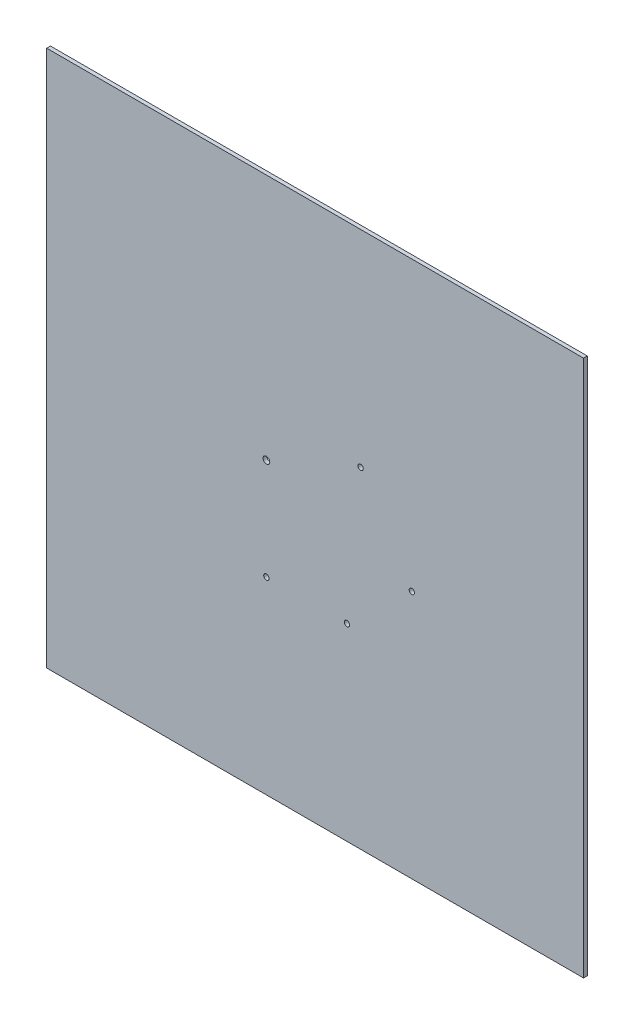
ISO-10303-21;
HEADER;
FILE_DESCRIPTION(('STEP AP214'),'2;1');
FILE_NAME('part.step','',(''),(''),'','','');
FILE_SCHEMA(('AUTOMOTIVE_DESIGN { 1 0 10303 214 1 1 1 1 }'));
ENDSEC;
DATA;
#1=APPLICATION_CONTEXT('core data for automotive mechanical design processes');
#2=APPLICATION_PROTOCOL_DEFINITION('international standard','automotive_design',2000,#1);
#3=PRODUCT_CONTEXT('',#1,'mechanical');
#4=PRODUCT('Part','Part','',(#3));
#5=PRODUCT_RELATED_PRODUCT_CATEGORY('part','',(#4));
#6=PRODUCT_DEFINITION_FORMATION('','',#4);
#7=PRODUCT_DEFINITION_CONTEXT('part definition',#1,'design');
#8=PRODUCT_DEFINITION('design','',#6,#7);
#9=PRODUCT_DEFINITION_SHAPE('','',#8);
#10=(LENGTH_UNIT() NAMED_UNIT(*) SI_UNIT(.MILLI.,.METRE.));
#11=(NAMED_UNIT(*) PLANE_ANGLE_UNIT() SI_UNIT($,.RADIAN.));
#12=(NAMED_UNIT(*) SI_UNIT($,.STERADIAN.) SOLID_ANGLE_UNIT());
#13=UNCERTAINTY_MEASURE_WITH_UNIT(LENGTH_MEASURE(1.E-05),#10,'distance_accuracy_value','');
#14=(GEOMETRIC_REPRESENTATION_CONTEXT(3) GLOBAL_UNCERTAINTY_ASSIGNED_CONTEXT((#13)) GLOBAL_UNIT_ASSIGNED_CONTEXT((#10,
#11,#12)) REPRESENTATION_CONTEXT('',''));
#15=CARTESIAN_POINT('',(0.,0.,0.));
#16=DIRECTION('',(0.,0.,1.));
#17=DIRECTION('',(1.,0.,0.));
#18=AXIS2_PLACEMENT_3D('',#15,#16,#17);
#19=CARTESIAN_POINT('',(-233.118251902345,-319.471085999582,4.445));
#20=DIRECTION('',(1.,0.,0.));
#21=DIRECTION('',(0.,1.,0.));
#22=AXIS2_PLACEMENT_3D('',#19,#20,#21);
#23=PLANE('',#22);
#24=DIRECTION('',(0.,-1.,0.));
#25=VECTOR('',#24,1.);
#26=CARTESIAN_POINT('',(-233.118251902345,-319.471085999582,0.));
#27=LINE('',#26,#25);
#28=CARTESIAN_POINT('',(-233.118251902346,315.528914000418,0.));
#29=VERTEX_POINT('',#28);
#30=CARTESIAN_POINT('',(-233.118251902345,-319.471085999582,0.));
#31=VERTEX_POINT('',#30);
#32=EDGE_CURVE('E96',#29,#31,#27,.T.);
#33=ORIENTED_EDGE('',*,*,#32,.T.);
#34=DIRECTION('',(0.,0.,-1.));
#35=VECTOR('',#34,1.);
#36=CARTESIAN_POINT('',(-233.118251902345,-319.471085999582,4.445));
#37=LINE('',#36,#35);
#38=CARTESIAN_POINT('',(-233.118251902345,-319.471085999582,4.445));
#39=VERTEX_POINT('',#38);
#40=EDGE_CURVE('E11',#39,#31,#37,.T.);
#41=ORIENTED_EDGE('',*,*,#40,.F.);
#42=DIRECTION('',(0.,-1.,0.));
#43=VECTOR('',#42,1.);
#44=CARTESIAN_POINT('',(-233.118251902345,-319.471085999582,4.445));
#45=LINE('',#44,#43);
#46=CARTESIAN_POINT('',(-233.118251902346,315.528914000418,4.445));
#47=VERTEX_POINT('',#46);
#48=EDGE_CURVE('E84',#47,#39,#45,.T.);
#49=ORIENTED_EDGE('',*,*,#48,.F.);
#50=DIRECTION('',(0.,0.,-1.));
#51=VECTOR('',#50,1.);
#52=CARTESIAN_POINT('',(-233.118251902346,315.528914000418,4.445));
#53=LINE('',#52,#51);
#54=EDGE_CURVE('E92',#47,#29,#53,.T.);
#55=ORIENTED_EDGE('',*,*,#54,.T.);
#56=EDGE_LOOP('',(#33,#41,#49,#55));
#57=FACE_BOUND('',#56,.T.);
#58=ADVANCED_FACE('F33',(#57),#23,.F.);
#59=CARTESIAN_POINT('',(401.881748097654,-319.471085999582,4.445));
#60=DIRECTION('',(0.,1.,0.));
#61=DIRECTION('',(0.,0.,1.));
#62=AXIS2_PLACEMENT_3D('',#59,#60,#61);
#63=PLANE('',#62);
#64=DIRECTION('',(1.,0.,0.));
#65=VECTOR('',#64,1.);
#66=CARTESIAN_POINT('',(401.881748097654,-319.471085999582,0.));
#67=LINE('',#66,#65);
#68=CARTESIAN_POINT('',(401.881748097654,-319.471085999582,0.));
#69=VERTEX_POINT('',#68);
#70=EDGE_CURVE('E88',#31,#69,#67,.T.);
#71=ORIENTED_EDGE('',*,*,#70,.T.);
#72=DIRECTION('',(0.,0.,-1.));
#73=VECTOR('',#72,1.);
#74=CARTESIAN_POINT('',(401.881748097654,-319.471085999582,4.445));
#75=LINE('',#74,#73);
#76=CARTESIAN_POINT('',(401.881748097654,-319.471085999582,4.445));
#77=VERTEX_POINT('',#76);
#78=EDGE_CURVE('E41',#77,#69,#75,.T.);
#79=ORIENTED_EDGE('',*,*,#78,.F.);
#80=DIRECTION('',(1.,0.,0.));
#81=VECTOR('',#80,1.);
#82=CARTESIAN_POINT('',(401.881748097654,-319.471085999582,4.445));
#83=LINE('',#82,#81);
#84=EDGE_CURVE('E79',#39,#77,#83,.T.);
#85=ORIENTED_EDGE('',*,*,#84,.F.);
#86=ORIENTED_EDGE('',*,*,#40,.T.);
#87=EDGE_LOOP('',(#71,#79,#85,#86));
#88=FACE_BOUND('',#87,.T.);
#89=ADVANCED_FACE('F87',(#88),#63,.F.);
#90=CARTESIAN_POINT('',(401.881748097654,-319.471085999582,4.445));
#91=DIRECTION('',(-1.,0.,0.));
#92=DIRECTION('',(0.,0.,1.));
#93=AXIS2_PLACEMENT_3D('',#90,#91,#92);
#94=PLANE('',#93);
#95=DIRECTION('',(0.,1.,0.));
#96=VECTOR('',#95,1.);
#97=CARTESIAN_POINT('',(401.881748097654,-319.471085999582,0.));
#98=LINE('',#97,#96);
#99=CARTESIAN_POINT('',(401.881748097654,315.528914000418,0.));
#100=VERTEX_POINT('',#99);
#101=EDGE_CURVE('E66',#69,#100,#98,.T.);
#102=ORIENTED_EDGE('',*,*,#101,.T.);
#103=DIRECTION('',(0.,0.,-1.));
#104=VECTOR('',#103,1.);
#105=CARTESIAN_POINT('',(401.881748097654,315.528914000418,4.445));
#106=LINE('',#105,#104);
#107=CARTESIAN_POINT('',(401.881748097654,315.528914000418,4.445));
#108=VERTEX_POINT('',#107);
#109=EDGE_CURVE('E89',#108,#100,#106,.T.);
#110=ORIENTED_EDGE('',*,*,#109,.F.);
#111=DIRECTION('',(0.,1.,0.));
#112=VECTOR('',#111,1.);
#113=CARTESIAN_POINT('',(401.881748097654,-319.471085999582,4.445));
#114=LINE('',#113,#112);
#115=EDGE_CURVE('E82',#77,#108,#114,.T.);
#116=ORIENTED_EDGE('',*,*,#115,.F.);
#117=ORIENTED_EDGE('',*,*,#78,.T.);
#118=EDGE_LOOP('',(#102,#110,#116,#117));
#119=FACE_BOUND('',#118,.T.);
#120=ADVANCED_FACE('F90',(#119),#94,.F.);
#121=CARTESIAN_POINT('',(401.881748097654,315.528914000418,4.445));
#122=DIRECTION('',(0.,-1.,0.));
#123=DIRECTION('',(1.,0.,0.));
#124=AXIS2_PLACEMENT_3D('',#121,#122,#123);
#125=PLANE('',#124);
#126=DIRECTION('',(-1.,0.,0.));
#127=VECTOR('',#126,1.);
#128=CARTESIAN_POINT('',(401.881748097654,315.528914000418,0.));
#129=LINE('',#128,#127);
#130=EDGE_CURVE('E72',#100,#29,#129,.T.);
#131=ORIENTED_EDGE('',*,*,#130,.T.);
#132=ORIENTED_EDGE('',*,*,#54,.F.);
#133=DIRECTION('',(-1.,0.,0.));
#134=VECTOR('',#133,1.);
#135=CARTESIAN_POINT('',(401.881748097654,315.528914000418,4.445));
#136=LINE('',#135,#134);
#137=EDGE_CURVE('E49',#108,#47,#136,.T.);
#138=ORIENTED_EDGE('',*,*,#137,.F.);
#139=ORIENTED_EDGE('',*,*,#109,.T.);
#140=EDGE_LOOP('',(#131,#132,#138,#139));
#141=FACE_BOUND('',#140,.T.);
#142=ADVANCED_FACE('F104',(#141),#125,.F.);
#143=CARTESIAN_POINT('',(0.,0.,4.445));
#144=DIRECTION('',(0.,0.,1.));
#145=DIRECTION('',(1.,0.,0.));
#146=AXIS2_PLACEMENT_3D('',#143,#144,#145);
#147=PLANE('',#146);
#148=CARTESIAN_POINT('',(26.7546595632283,23.469712844957,4.445));
#149=DIRECTION('',(0.,0.,-1.));
#150=DIRECTION('',(-1.,0.,0.));
#151=AXIS2_PLACEMENT_3D('',#148,#149,#150);
#152=CIRCLE('',#151,3.97509999999999);
#153=CARTESIAN_POINT('',(22.7795595632283,23.469712844957,4.445));
#154=VERTEX_POINT('',#153);
#155=EDGE_CURVE('E131',#154,#154,#152,.T.);
#156=ORIENTED_EDGE('',*,*,#155,.T.);
#157=EDGE_LOOP('',(#156));
#158=FACE_BOUND('',#157,.T.);
#159=CARTESIAN_POINT('',(26.7546595632283,-96.265887155043,4.445));
#160=DIRECTION('',(0.,0.,-1.));
#161=DIRECTION('',(-1.,0.,0.));
#162=AXIS2_PLACEMENT_3D('',#159,#160,#161);
#163=CIRCLE('',#162,3.175);
#164=CARTESIAN_POINT('',(23.5796595632283,-96.265887155043,4.445));
#165=VERTEX_POINT('',#164);
#166=EDGE_CURVE('E125',#165,#165,#163,.T.);
#167=ORIENTED_EDGE('',*,*,#166,.T.);
#168=EDGE_LOOP('',(#167));
#169=FACE_BOUND('',#168,.T.);
#170=CARTESIAN_POINT('',(122.004659563229,-96.265887155043,4.445));
#171=DIRECTION('',(0.,0.,-1.));
#172=DIRECTION('',(-1.,0.,0.));
#173=AXIS2_PLACEMENT_3D('',#170,#171,#172);
#174=CIRCLE('',#173,3.175);
#175=CARTESIAN_POINT('',(118.829659563229,-96.265887155043,4.445));
#176=VERTEX_POINT('',#175);
#177=EDGE_CURVE('E119',#176,#176,#174,.T.);
#178=ORIENTED_EDGE('',*,*,#177,.T.);
#179=EDGE_LOOP('',(#178));
#180=FACE_BOUND('',#179,.T.);
#181=CARTESIAN_POINT('',(198.809547248106,-25.0001180038349,4.445));
#182=DIRECTION('',(0.,0.,-1.));
#183=DIRECTION('',(-1.,0.,0.));
#184=AXIS2_PLACEMENT_3D('',#181,#182,#183);
#185=CIRCLE('',#184,3.17499999999997);
#186=CARTESIAN_POINT('',(195.634547248106,-25.0001180038349,4.445));
#187=VERTEX_POINT('',#186);
#188=EDGE_CURVE('E113',#187,#187,#185,.T.);
#189=ORIENTED_EDGE('',*,*,#188,.T.);
#190=EDGE_LOOP('',(#189));
#191=FACE_BOUND('',#190,.T.);
#192=CARTESIAN_POINT('',(138.143199548221,71.8713651930099,4.445));
#193=DIRECTION('',(0.,0.,-1.));
#194=DIRECTION('',(-1.,0.,0.));
#195=AXIS2_PLACEMENT_3D('',#192,#193,#194);
#196=CIRCLE('',#195,3.175);
#197=CARTESIAN_POINT('',(134.968199548221,71.8713651930099,4.445));
#198=VERTEX_POINT('',#197);
#199=EDGE_CURVE('E99',#198,#198,#196,.T.);
#200=ORIENTED_EDGE('',*,*,#199,.T.);
#201=EDGE_LOOP('',(#200));
#202=FACE_BOUND('',#201,.T.);
#203=ORIENTED_EDGE('',*,*,#48,.T.);
#204=ORIENTED_EDGE('',*,*,#84,.T.);
#205=ORIENTED_EDGE('',*,*,#115,.T.);
#206=ORIENTED_EDGE('',*,*,#137,.T.);
#207=EDGE_LOOP('',(#203,#204,#205,#206));
#208=FACE_BOUND('',#207,.T.);
#209=ADVANCED_FACE('F80',(#158,#169,#180,#191,#202,#208),#147,.T.);
#210=CARTESIAN_POINT('',(0.,0.,0.));
#211=DIRECTION('',(0.,0.,1.));
#212=DIRECTION('',(1.,0.,0.));
#213=AXIS2_PLACEMENT_3D('',#210,#211,#212);
#214=PLANE('',#213);
#215=CARTESIAN_POINT('',(26.7546595632283,23.469712844957,0.));
#216=DIRECTION('',(0.,0.,-1.));
#217=DIRECTION('',(-1.,0.,0.));
#218=AXIS2_PLACEMENT_3D('',#215,#216,#217);
#219=CIRCLE('',#218,3.97509999999999);
#220=CARTESIAN_POINT('',(22.7795595632283,23.469712844957,0.));
#221=VERTEX_POINT('',#220);
#222=EDGE_CURVE('E134',#221,#221,#219,.T.);
#223=ORIENTED_EDGE('',*,*,#222,.F.);
#224=EDGE_LOOP('',(#223));
#225=FACE_BOUND('',#224,.T.);
#226=CARTESIAN_POINT('',(26.7546595632283,-96.265887155043,0.));
#227=DIRECTION('',(0.,0.,-1.));
#228=DIRECTION('',(-1.,0.,0.));
#229=AXIS2_PLACEMENT_3D('',#226,#227,#228);
#230=CIRCLE('',#229,3.175);
#231=CARTESIAN_POINT('',(23.5796595632283,-96.265887155043,0.));
#232=VERTEX_POINT('',#231);
#233=EDGE_CURVE('E128',#232,#232,#230,.T.);
#234=ORIENTED_EDGE('',*,*,#233,.F.);
#235=EDGE_LOOP('',(#234));
#236=FACE_BOUND('',#235,.T.);
#237=CARTESIAN_POINT('',(122.004659563229,-96.265887155043,0.));
#238=DIRECTION('',(0.,0.,-1.));
#239=DIRECTION('',(-1.,0.,0.));
#240=AXIS2_PLACEMENT_3D('',#237,#238,#239);
#241=CIRCLE('',#240,3.175);
#242=CARTESIAN_POINT('',(118.829659563229,-96.265887155043,0.));
#243=VERTEX_POINT('',#242);
#244=EDGE_CURVE('E122',#243,#243,#241,.T.);
#245=ORIENTED_EDGE('',*,*,#244,.F.);
#246=EDGE_LOOP('',(#245));
#247=FACE_BOUND('',#246,.T.);
#248=CARTESIAN_POINT('',(198.809547248106,-25.0001180038349,0.));
#249=DIRECTION('',(0.,0.,-1.));
#250=DIRECTION('',(-1.,0.,0.));
#251=AXIS2_PLACEMENT_3D('',#248,#249,#250);
#252=CIRCLE('',#251,3.17499999999997);
#253=CARTESIAN_POINT('',(195.634547248106,-25.0001180038349,0.));
#254=VERTEX_POINT('',#253);
#255=EDGE_CURVE('E116',#254,#254,#252,.T.);
#256=ORIENTED_EDGE('',*,*,#255,.F.);
#257=EDGE_LOOP('',(#256));
#258=FACE_BOUND('',#257,.T.);
#259=CARTESIAN_POINT('',(138.143199548221,71.8713651930099,0.));
#260=DIRECTION('',(0.,0.,-1.));
#261=DIRECTION('',(-1.,0.,0.));
#262=AXIS2_PLACEMENT_3D('',#259,#260,#261);
#263=CIRCLE('',#262,3.175);
#264=CARTESIAN_POINT('',(134.968199548221,71.8713651930099,0.));
#265=VERTEX_POINT('',#264);
#266=EDGE_CURVE('E110',#265,#265,#263,.T.);
#267=ORIENTED_EDGE('',*,*,#266,.F.);
#268=EDGE_LOOP('',(#267));
#269=FACE_BOUND('',#268,.T.);
#270=ORIENTED_EDGE('',*,*,#32,.F.);
#271=ORIENTED_EDGE('',*,*,#130,.F.);
#272=ORIENTED_EDGE('',*,*,#101,.F.);
#273=ORIENTED_EDGE('',*,*,#70,.F.);
#274=EDGE_LOOP('',(#270,#271,#272,#273));
#275=FACE_BOUND('',#274,.T.);
#276=ADVANCED_FACE('F107',(#225,#236,#247,#258,#269,#275),#214,.F.);
#277=CARTESIAN_POINT('',(138.143199548221,71.8713651930099,4.445));
#278=DIRECTION('',(0.,0.,-1.));
#279=DIRECTION('',(-1.,0.,0.));
#280=AXIS2_PLACEMENT_3D('',#277,#278,#279);
#281=CYLINDRICAL_SURFACE('',#280,3.175);
#282=ORIENTED_EDGE('',*,*,#199,.F.);
#283=EDGE_LOOP('',(#282));
#284=FACE_BOUND('',#283,.T.);
#285=ORIENTED_EDGE('',*,*,#266,.T.);
#286=EDGE_LOOP('',(#285));
#287=FACE_BOUND('',#286,.T.);
#288=ADVANCED_FACE('F151',(#284,#287),#281,.F.);
#289=CARTESIAN_POINT('',(198.809547248106,-25.0001180038349,4.445));
#290=DIRECTION('',(0.,0.,-1.));
#291=DIRECTION('',(-1.,0.,0.));
#292=AXIS2_PLACEMENT_3D('',#289,#290,#291);
#293=CYLINDRICAL_SURFACE('',#292,3.17499999999997);
#294=ORIENTED_EDGE('',*,*,#188,.F.);
#295=EDGE_LOOP('',(#294));
#296=FACE_BOUND('',#295,.T.);
#297=ORIENTED_EDGE('',*,*,#255,.T.);
#298=EDGE_LOOP('',(#297));
#299=FACE_BOUND('',#298,.T.);
#300=ADVANCED_FACE('F162',(#296,#299),#293,.F.);
#301=CARTESIAN_POINT('',(122.004659563229,-96.265887155043,4.445));
#302=DIRECTION('',(0.,0.,-1.));
#303=DIRECTION('',(-1.,0.,0.));
#304=AXIS2_PLACEMENT_3D('',#301,#302,#303);
#305=CYLINDRICAL_SURFACE('',#304,3.175);
#306=ORIENTED_EDGE('',*,*,#177,.F.);
#307=EDGE_LOOP('',(#306));
#308=FACE_BOUND('',#307,.T.);
#309=ORIENTED_EDGE('',*,*,#244,.T.);
#310=EDGE_LOOP('',(#309));
#311=FACE_BOUND('',#310,.T.);
#312=ADVANCED_FACE('F168',(#308,#311),#305,.F.);
#313=CARTESIAN_POINT('',(26.7546595632283,-96.265887155043,4.445));
#314=DIRECTION('',(0.,0.,-1.));
#315=DIRECTION('',(-1.,0.,0.));
#316=AXIS2_PLACEMENT_3D('',#313,#314,#315);
#317=CYLINDRICAL_SURFACE('',#316,3.175);
#318=ORIENTED_EDGE('',*,*,#166,.F.);
#319=EDGE_LOOP('',(#318));
#320=FACE_BOUND('',#319,.T.);
#321=ORIENTED_EDGE('',*,*,#233,.T.);
#322=EDGE_LOOP('',(#321));
#323=FACE_BOUND('',#322,.T.);
#324=ADVANCED_FACE('F145',(#320,#323),#317,.F.);
#325=CARTESIAN_POINT('',(26.7546595632283,23.469712844957,4.445));
#326=DIRECTION('',(0.,0.,-1.));
#327=DIRECTION('',(-1.,0.,0.));
#328=AXIS2_PLACEMENT_3D('',#325,#326,#327);
#329=CYLINDRICAL_SURFACE('',#328,3.97509999999999);
#330=ORIENTED_EDGE('',*,*,#155,.F.);
#331=EDGE_LOOP('',(#330));
#332=FACE_BOUND('',#331,.T.);
#333=ORIENTED_EDGE('',*,*,#222,.T.);
#334=EDGE_LOOP('',(#333));
#335=FACE_BOUND('',#334,.T.);
#336=ADVANCED_FACE('F142',(#332,#335),#329,.F.);
#337=CLOSED_SHELL('',(#58,#89,#120,#142,#209,#276,#288,#300,#312,#324,#336));
#338=MANIFOLD_SOLID_BREP('B2',#337);
#339=ADVANCED_BREP_SHAPE_REPRESENTATION('',(#18,#338),#14);
#340=SHAPE_DEFINITION_REPRESENTATION(#9,#339);
ENDSEC;
END-ISO-10303-21;
